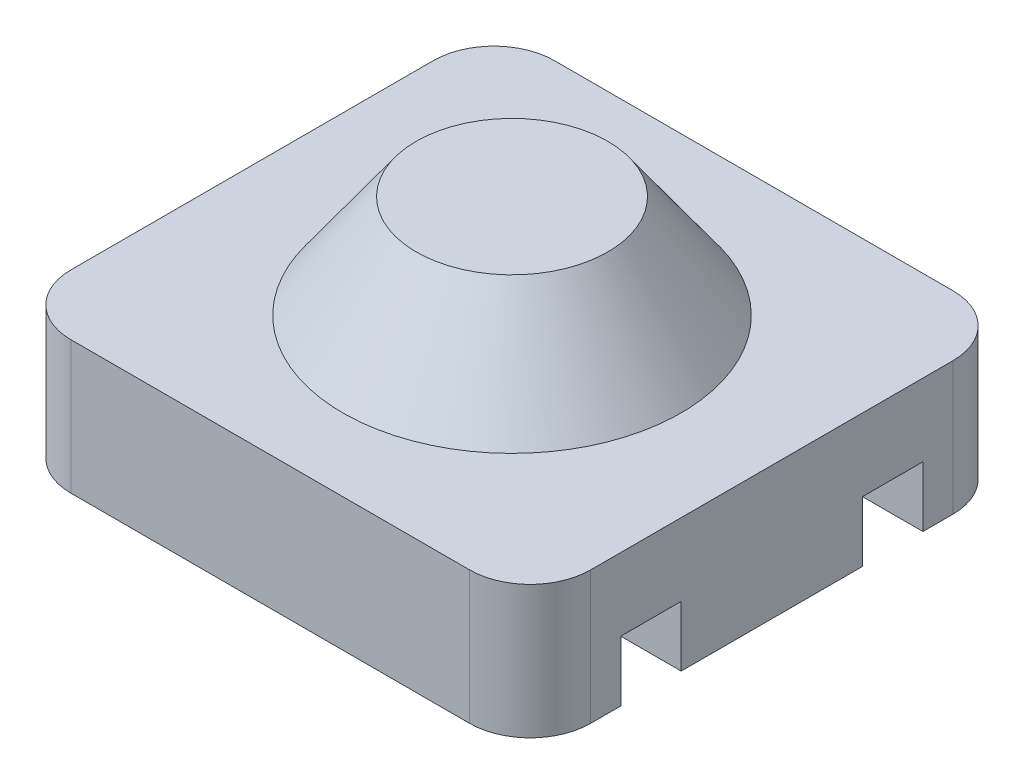
ISO-10303-21;
HEADER;
FILE_DESCRIPTION(('STEP AP214'),'2;1');
FILE_NAME('part.step','',(''),(''),'','','');
FILE_SCHEMA(('AUTOMOTIVE_DESIGN { 1 0 10303 214 1 1 1 1 }'));
ENDSEC;
DATA;
#1=APPLICATION_CONTEXT('core data for automotive mechanical design processes');
#2=APPLICATION_PROTOCOL_DEFINITION('international standard','automotive_design',2000,#1);
#3=PRODUCT_CONTEXT('',#1,'mechanical');
#4=PRODUCT('Part','Part','',(#3));
#5=PRODUCT_RELATED_PRODUCT_CATEGORY('part','',(#4));
#6=PRODUCT_DEFINITION_FORMATION('','',#4);
#7=PRODUCT_DEFINITION_CONTEXT('part definition',#1,'design');
#8=PRODUCT_DEFINITION('design','',#6,#7);
#9=PRODUCT_DEFINITION_SHAPE('','',#8);
#10=(LENGTH_UNIT() NAMED_UNIT(*) SI_UNIT(.MILLI.,.METRE.));
#11=(NAMED_UNIT(*) PLANE_ANGLE_UNIT() SI_UNIT($,.RADIAN.));
#12=(NAMED_UNIT(*) SI_UNIT($,.STERADIAN.) SOLID_ANGLE_UNIT());
#13=UNCERTAINTY_MEASURE_WITH_UNIT(LENGTH_MEASURE(1.E-05),#10,'distance_accuracy_value','');
#14=(GEOMETRIC_REPRESENTATION_CONTEXT(3) GLOBAL_UNCERTAINTY_ASSIGNED_CONTEXT((#13)) GLOBAL_UNIT_ASSIGNED_CONTEXT((#10,
#11,#12)) REPRESENTATION_CONTEXT('',''));
#15=CARTESIAN_POINT('',(0.,0.,0.));
#16=DIRECTION('',(0.,0.,1.));
#17=DIRECTION('',(1.,0.,0.));
#18=AXIS2_PLACEMENT_3D('',#15,#16,#17);
#19=CARTESIAN_POINT('',(0.,1.,-2.5));
#20=DIRECTION('',(0.,0.,-1.));
#21=DIRECTION('',(0.,-1.,0.));
#22=AXIS2_PLACEMENT_3D('',#19,#20,#21);
#23=PLANE('',#22);
#24=DIRECTION('',(1.,0.,0.));
#25=VECTOR('',#24,1.);
#26=CARTESIAN_POINT('',(0.,1.,-2.5));
#27=LINE('',#26,#25);
#28=CARTESIAN_POINT('',(0.,1.,-2.5));
#29=VERTEX_POINT('',#28);
#30=CARTESIAN_POINT('',(1.,1.,-2.5));
#31=VERTEX_POINT('',#30);
#32=EDGE_CURVE('E10',#29,#31,#27,.T.);
#33=ORIENTED_EDGE('',*,*,#32,.F.);
#34=DIRECTION('',(0.,-1.,0.));
#35=VECTOR('',#34,1.);
#36=CARTESIAN_POINT('',(0.,1.,-2.5));
#37=LINE('',#36,#35);
#38=CARTESIAN_POINT('',(0.,0.,-2.5));
#39=VERTEX_POINT('',#38);
#40=EDGE_CURVE('E402',#29,#39,#37,.T.);
#41=ORIENTED_EDGE('',*,*,#40,.T.);
#42=DIRECTION('',(1.,0.,0.));
#43=VECTOR('',#42,1.);
#44=CARTESIAN_POINT('',(0.,0.,-2.5));
#45=LINE('',#44,#43);
#46=CARTESIAN_POINT('',(1.,0.,-2.5));
#47=VERTEX_POINT('',#46);
#48=EDGE_CURVE('E321',#39,#47,#45,.T.);
#49=ORIENTED_EDGE('',*,*,#48,.T.);
#50=DIRECTION('',(0.,-1.,0.));
#51=VECTOR('',#50,1.);
#52=CARTESIAN_POINT('',(1.,-0.00100000000000013,-2.5));
#53=LINE('',#52,#51);
#54=EDGE_CURVE('E411',#31,#47,#53,.T.);
#55=ORIENTED_EDGE('',*,*,#54,.F.);
#56=EDGE_LOOP('',(#33,#41,#49,#55));
#57=FACE_BOUND('',#56,.T.);
#58=ADVANCED_FACE('F16',(#57),#23,.F.);
#59=CARTESIAN_POINT('',(0.,1.,-1.5));
#60=DIRECTION('',(0.,0.,1.));
#61=DIRECTION('',(1.,0.,0.));
#62=AXIS2_PLACEMENT_3D('',#59,#60,#61);
#63=PLANE('',#62);
#64=DIRECTION('',(-1.,0.,0.));
#65=VECTOR('',#64,1.);
#66=CARTESIAN_POINT('',(0.,0.,-1.5));
#67=LINE('',#66,#65);
#68=CARTESIAN_POINT('',(1.,0.,-1.5));
#69=VERTEX_POINT('',#68);
#70=CARTESIAN_POINT('',(0.,0.,-1.5));
#71=VERTEX_POINT('',#70);
#72=EDGE_CURVE('E406',#69,#71,#67,.T.);
#73=ORIENTED_EDGE('',*,*,#72,.T.);
#74=DIRECTION('',(0.,-1.,0.));
#75=VECTOR('',#74,1.);
#76=CARTESIAN_POINT('',(0.,1.,-1.5));
#77=LINE('',#76,#75);
#78=CARTESIAN_POINT('',(0.,1.,-1.5));
#79=VERTEX_POINT('',#78);
#80=EDGE_CURVE('E314',#79,#71,#77,.T.);
#81=ORIENTED_EDGE('',*,*,#80,.F.);
#82=DIRECTION('',(-1.,0.,0.));
#83=VECTOR('',#82,1.);
#84=CARTESIAN_POINT('',(0.,1.,-1.5));
#85=LINE('',#84,#83);
#86=CARTESIAN_POINT('',(1.,1.,-1.5));
#87=VERTEX_POINT('',#86);
#88=EDGE_CURVE('E27',#87,#79,#85,.T.);
#89=ORIENTED_EDGE('',*,*,#88,.F.);
#90=DIRECTION('',(0.,1.,0.));
#91=VECTOR('',#90,1.);
#92=CARTESIAN_POINT('',(1.,-0.00100000000000013,-1.5));
#93=LINE('',#92,#91);
#94=EDGE_CURVE('E412',#69,#87,#93,.T.);
#95=ORIENTED_EDGE('',*,*,#94,.F.);
#96=EDGE_LOOP('',(#73,#81,#89,#95));
#97=FACE_BOUND('',#96,.T.);
#98=ADVANCED_FACE('F1041',(#97),#63,.F.);
#99=CARTESIAN_POINT('',(0.,1.,0.));
#100=DIRECTION('',(0.,-1.,0.));
#101=DIRECTION('',(0.,0.,-1.));
#102=AXIS2_PLACEMENT_3D('',#99,#100,#101);
#103=PLANE('',#102);
#104=DIRECTION('',(0.,0.,1.));
#105=VECTOR('',#104,1.);
#106=CARTESIAN_POINT('',(1.,1.,-7.));
#107=LINE('',#106,#105);
#108=EDGE_CURVE('E407',#31,#87,#107,.T.);
#109=ORIENTED_EDGE('',*,*,#108,.T.);
#110=ORIENTED_EDGE('',*,*,#88,.T.);
#111=DIRECTION('',(0.,0.,-1.));
#112=VECTOR('',#111,1.);
#113=CARTESIAN_POINT('',(0.,1.,-1.5));
#114=LINE('',#113,#112);
#115=EDGE_CURVE('E310',#79,#29,#114,.T.);
#116=ORIENTED_EDGE('',*,*,#115,.T.);
#117=ORIENTED_EDGE('',*,*,#32,.T.);
#118=EDGE_LOOP('',(#109,#110,#116,#117));
#119=FACE_BOUND('',#118,.T.);
#120=ADVANCED_FACE('F986',(#119),#103,.T.);
#121=CARTESIAN_POINT('',(0.,1.,0.));
#122=DIRECTION('',(0.,-1.,0.));
#123=DIRECTION('',(0.,0.,-1.));
#124=AXIS2_PLACEMENT_3D('',#121,#122,#123);
#125=PLANE('',#124);
#126=DIRECTION('',(0.,0.,-1.));
#127=VECTOR('',#126,1.);
#128=CARTESIAN_POINT('',(7.6,1.,-7.));
#129=LINE('',#128,#127);
#130=CARTESIAN_POINT('',(7.6,1.,-1.5));
#131=VERTEX_POINT('',#130);
#132=CARTESIAN_POINT('',(7.6,1.,-2.5));
#133=VERTEX_POINT('',#132);
#134=EDGE_CURVE('E463',#131,#133,#129,.T.);
#135=ORIENTED_EDGE('',*,*,#134,.T.);
#136=DIRECTION('',(1.,0.,0.));
#137=VECTOR('',#136,1.);
#138=CARTESIAN_POINT('',(0.,1.,-2.5));
#139=LINE('',#138,#137);
#140=CARTESIAN_POINT('',(8.6,1.,-2.5));
#141=VERTEX_POINT('',#140);
#142=EDGE_CURVE('E280',#133,#141,#139,.T.);
#143=ORIENTED_EDGE('',*,*,#142,.T.);
#144=DIRECTION('',(0.,0.,1.));
#145=VECTOR('',#144,1.);
#146=CARTESIAN_POINT('',(8.6,1.,-1.5));
#147=LINE('',#146,#145);
#148=CARTESIAN_POINT('',(8.6,1.,-1.5));
#149=VERTEX_POINT('',#148);
#150=EDGE_CURVE('E342',#141,#149,#147,.T.);
#151=ORIENTED_EDGE('',*,*,#150,.T.);
#152=DIRECTION('',(-1.,0.,0.));
#153=VECTOR('',#152,1.);
#154=CARTESIAN_POINT('',(0.,1.,-1.5));
#155=LINE('',#154,#153);
#156=EDGE_CURVE('E490',#149,#131,#155,.T.);
#157=ORIENTED_EDGE('',*,*,#156,.T.);
#158=EDGE_LOOP('',(#135,#143,#151,#157));
#159=FACE_BOUND('',#158,.T.);
#160=ADVANCED_FACE('F689',(#159),#125,.T.);
#161=CARTESIAN_POINT('',(0.,1.,-1.5));
#162=DIRECTION('',(0.,0.,1.));
#163=DIRECTION('',(1.,0.,0.));
#164=AXIS2_PLACEMENT_3D('',#161,#162,#163);
#165=PLANE('',#164);
#166=ORIENTED_EDGE('',*,*,#156,.F.);
#167=DIRECTION('',(0.,-1.,0.));
#168=VECTOR('',#167,1.);
#169=CARTESIAN_POINT('',(8.6,1.,-1.5));
#170=LINE('',#169,#168);
#171=CARTESIAN_POINT('',(8.6,0.,-1.5));
#172=VERTEX_POINT('',#171);
#173=EDGE_CURVE('E346',#149,#172,#170,.T.);
#174=ORIENTED_EDGE('',*,*,#173,.T.);
#175=DIRECTION('',(-1.,0.,0.));
#176=VECTOR('',#175,1.);
#177=CARTESIAN_POINT('',(0.,0.,-1.5));
#178=LINE('',#177,#176);
#179=CARTESIAN_POINT('',(7.6,0.,-1.5));
#180=VERTEX_POINT('',#179);
#181=EDGE_CURVE('E413',#172,#180,#178,.T.);
#182=ORIENTED_EDGE('',*,*,#181,.T.);
#183=DIRECTION('',(0.,-1.,0.));
#184=VECTOR('',#183,1.);
#185=CARTESIAN_POINT('',(7.6,-0.00100000000000013,-1.5));
#186=LINE('',#185,#184);
#187=EDGE_CURVE('E308',#131,#180,#186,.T.);
#188=ORIENTED_EDGE('',*,*,#187,.F.);
#189=EDGE_LOOP('',(#166,#174,#182,#188));
#190=FACE_BOUND('',#189,.T.);
#191=ADVANCED_FACE('F692',(#190),#165,.F.);
#192=CARTESIAN_POINT('',(0.,1.,-2.5));
#193=DIRECTION('',(0.,0.,-1.));
#194=DIRECTION('',(0.,-1.,0.));
#195=AXIS2_PLACEMENT_3D('',#192,#193,#194);
#196=PLANE('',#195);
#197=DIRECTION('',(1.,0.,0.));
#198=VECTOR('',#197,1.);
#199=CARTESIAN_POINT('',(0.,0.,-2.5));
#200=LINE('',#199,#198);
#201=CARTESIAN_POINT('',(7.6,0.,-2.5));
#202=VERTEX_POINT('',#201);
#203=CARTESIAN_POINT('',(8.6,0.,-2.5));
#204=VERTEX_POINT('',#203);
#205=EDGE_CURVE('E428',#202,#204,#200,.T.);
#206=ORIENTED_EDGE('',*,*,#205,.T.);
#207=DIRECTION('',(0.,-1.,0.));
#208=VECTOR('',#207,1.);
#209=CARTESIAN_POINT('',(8.6,1.,-2.5));
#210=LINE('',#209,#208);
#211=EDGE_CURVE('E345',#141,#204,#210,.T.);
#212=ORIENTED_EDGE('',*,*,#211,.F.);
#213=ORIENTED_EDGE('',*,*,#142,.F.);
#214=DIRECTION('',(0.,1.,0.));
#215=VECTOR('',#214,1.);
#216=CARTESIAN_POINT('',(7.6,-0.00100000000000013,-2.5));
#217=LINE('',#216,#215);
#218=EDGE_CURVE('E500',#202,#133,#217,.T.);
#219=ORIENTED_EDGE('',*,*,#218,.F.);
#220=EDGE_LOOP('',(#206,#212,#213,#219));
#221=FACE_BOUND('',#220,.T.);
#222=ADVANCED_FACE('F686',(#221),#196,.F.);
#223=CARTESIAN_POINT('',(8.6,1.,-5.5));
#224=DIRECTION('',(0.,0.,1.));
#225=DIRECTION('',(1.,0.,0.));
#226=AXIS2_PLACEMENT_3D('',#223,#224,#225);
#227=PLANE('',#226);
#228=DIRECTION('',(-1.,0.,0.));
#229=VECTOR('',#228,1.);
#230=CARTESIAN_POINT('',(8.6,1.,-5.5));
#231=LINE('',#230,#229);
#232=CARTESIAN_POINT('',(8.6,1.,-5.5));
#233=VERTEX_POINT('',#232);
#234=CARTESIAN_POINT('',(7.6,1.,-5.5));
#235=VERTEX_POINT('',#234);
#236=EDGE_CURVE('E268',#233,#235,#231,.T.);
#237=ORIENTED_EDGE('',*,*,#236,.F.);
#238=DIRECTION('',(0.,-1.,0.));
#239=VECTOR('',#238,1.);
#240=CARTESIAN_POINT('',(8.6,1.,-5.5));
#241=LINE('',#240,#239);
#242=CARTESIAN_POINT('',(8.6,0.,-5.5));
#243=VERTEX_POINT('',#242);
#244=EDGE_CURVE('E453',#233,#243,#241,.T.);
#245=ORIENTED_EDGE('',*,*,#244,.T.);
#246=DIRECTION('',(-1.,0.,0.));
#247=VECTOR('',#246,1.);
#248=CARTESIAN_POINT('',(8.6,0.,-5.5));
#249=LINE('',#248,#247);
#250=CARTESIAN_POINT('',(7.6,0.,-5.5));
#251=VERTEX_POINT('',#250);
#252=EDGE_CURVE('E287',#243,#251,#249,.T.);
#253=ORIENTED_EDGE('',*,*,#252,.T.);
#254=DIRECTION('',(0.,-1.,0.));
#255=VECTOR('',#254,1.);
#256=CARTESIAN_POINT('',(7.6,-0.00100000000000013,-5.5));
#257=LINE('',#256,#255);
#258=EDGE_CURVE('E284',#235,#251,#257,.T.);
#259=ORIENTED_EDGE('',*,*,#258,.F.);
#260=EDGE_LOOP('',(#237,#245,#253,#259));
#261=FACE_BOUND('',#260,.T.);
#262=ADVANCED_FACE('F285',(#261),#227,.F.);
#263=CARTESIAN_POINT('',(8.6,1.,-6.5));
#264=DIRECTION('',(0.,0.,-1.));
#265=DIRECTION('',(0.,-1.,0.));
#266=AXIS2_PLACEMENT_3D('',#263,#264,#265);
#267=PLANE('',#266);
#268=DIRECTION('',(1.,0.,0.));
#269=VECTOR('',#268,1.);
#270=CARTESIAN_POINT('',(0.,0.,-6.5));
#271=LINE('',#270,#269);
#272=CARTESIAN_POINT('',(7.6,0.,-6.5));
#273=VERTEX_POINT('',#272);
#274=CARTESIAN_POINT('',(8.6,0.,-6.5));
#275=VERTEX_POINT('',#274);
#276=EDGE_CURVE('E380',#273,#275,#271,.T.);
#277=ORIENTED_EDGE('',*,*,#276,.T.);
#278=DIRECTION('',(0.,-1.,0.));
#279=VECTOR('',#278,1.);
#280=CARTESIAN_POINT('',(8.6,1.,-6.5));
#281=LINE('',#280,#279);
#282=CARTESIAN_POINT('',(8.6,1.,-6.5));
#283=VERTEX_POINT('',#282);
#284=EDGE_CURVE('E449',#283,#275,#281,.T.);
#285=ORIENTED_EDGE('',*,*,#284,.F.);
#286=DIRECTION('',(1.,0.,0.));
#287=VECTOR('',#286,1.);
#288=CARTESIAN_POINT('',(8.6,1.,-6.5));
#289=LINE('',#288,#287);
#290=CARTESIAN_POINT('',(7.6,1.,-6.5));
#291=VERTEX_POINT('',#290);
#292=EDGE_CURVE('E281',#291,#283,#289,.T.);
#293=ORIENTED_EDGE('',*,*,#292,.F.);
#294=DIRECTION('',(0.,1.,0.));
#295=VECTOR('',#294,1.);
#296=CARTESIAN_POINT('',(7.6,-0.00100000000000013,-6.5));
#297=LINE('',#296,#295);
#298=EDGE_CURVE('E297',#273,#291,#297,.T.);
#299=ORIENTED_EDGE('',*,*,#298,.F.);
#300=EDGE_LOOP('',(#277,#285,#293,#299));
#301=FACE_BOUND('',#300,.T.);
#302=ADVANCED_FACE('F660',(#301),#267,.F.);
#303=CARTESIAN_POINT('',(0.,1.,0.));
#304=DIRECTION('',(0.,1.,0.));
#305=DIRECTION('',(1.,0.,0.));
#306=AXIS2_PLACEMENT_3D('',#303,#304,#305);
#307=PLANE('',#306);
#308=ORIENTED_EDGE('',*,*,#292,.T.);
#309=DIRECTION('',(0.,0.,1.));
#310=VECTOR('',#309,1.);
#311=CARTESIAN_POINT('',(8.6,1.,-5.5));
#312=LINE('',#311,#310);
#313=EDGE_CURVE('E275',#283,#233,#312,.T.);
#314=ORIENTED_EDGE('',*,*,#313,.T.);
#315=ORIENTED_EDGE('',*,*,#236,.T.);
#316=DIRECTION('',(0.,0.,1.));
#317=VECTOR('',#316,1.);
#318=CARTESIAN_POINT('',(7.6,1.,-7.));
#319=LINE('',#318,#317);
#320=EDGE_CURVE('E272',#291,#235,#319,.T.);
#321=ORIENTED_EDGE('',*,*,#320,.F.);
#322=EDGE_LOOP('',(#308,#314,#315,#321));
#323=FACE_BOUND('',#322,.T.);
#324=ADVANCED_FACE('F270',(#323),#307,.F.);
#325=CARTESIAN_POINT('',(0.,1.,0.));
#326=DIRECTION('',(0.,1.,0.));
#327=DIRECTION('',(1.,0.,0.));
#328=AXIS2_PLACEMENT_3D('',#325,#326,#327);
#329=PLANE('',#328);
#330=DIRECTION('',(-1.,0.,0.));
#331=VECTOR('',#330,1.);
#332=CARTESIAN_POINT('',(8.6,1.,-5.5));
#333=LINE('',#332,#331);
#334=CARTESIAN_POINT('',(1.,1.,-5.5));
#335=VERTEX_POINT('',#334);
#336=CARTESIAN_POINT('',(0.,1.,-5.5));
#337=VERTEX_POINT('',#336);
#338=EDGE_CURVE('E383',#335,#337,#333,.T.);
#339=ORIENTED_EDGE('',*,*,#338,.T.);
#340=DIRECTION('',(0.,0.,-1.));
#341=VECTOR('',#340,1.);
#342=CARTESIAN_POINT('',(0.,1.,-5.5));
#343=LINE('',#342,#341);
#344=CARTESIAN_POINT('',(0.,1.,-6.5));
#345=VERTEX_POINT('',#344);
#346=EDGE_CURVE('E559',#337,#345,#343,.T.);
#347=ORIENTED_EDGE('',*,*,#346,.T.);
#348=DIRECTION('',(1.,0.,0.));
#349=VECTOR('',#348,1.);
#350=CARTESIAN_POINT('',(8.6,1.,-6.5));
#351=LINE('',#350,#349);
#352=CARTESIAN_POINT('',(1.,1.,-6.5));
#353=VERTEX_POINT('',#352);
#354=EDGE_CURVE('E470',#345,#353,#351,.T.);
#355=ORIENTED_EDGE('',*,*,#354,.T.);
#356=DIRECTION('',(0.,0.,-1.));
#357=VECTOR('',#356,1.);
#358=CARTESIAN_POINT('',(1.,1.,-7.));
#359=LINE('',#358,#357);
#360=EDGE_CURVE('E525',#335,#353,#359,.T.);
#361=ORIENTED_EDGE('',*,*,#360,.F.);
#362=EDGE_LOOP('',(#339,#347,#355,#361));
#363=FACE_BOUND('',#362,.T.);
#364=ADVANCED_FACE('F969',(#363),#329,.F.);
#365=CARTESIAN_POINT('',(8.6,1.,-5.5));
#366=DIRECTION('',(0.,0.,1.));
#367=DIRECTION('',(1.,0.,0.));
#368=AXIS2_PLACEMENT_3D('',#365,#366,#367);
#369=PLANE('',#368);
#370=DIRECTION('',(-1.,0.,0.));
#371=VECTOR('',#370,1.);
#372=CARTESIAN_POINT('',(0.,0.,-5.5));
#373=LINE('',#372,#371);
#374=CARTESIAN_POINT('',(1.,0.,-5.5));
#375=VERTEX_POINT('',#374);
#376=CARTESIAN_POINT('',(0.,0.,-5.5));
#377=VERTEX_POINT('',#376);
#378=EDGE_CURVE('E320',#375,#377,#373,.T.);
#379=ORIENTED_EDGE('',*,*,#378,.T.);
#380=DIRECTION('',(0.,-1.,0.));
#381=VECTOR('',#380,1.);
#382=CARTESIAN_POINT('',(0.,1.,-5.5));
#383=LINE('',#382,#381);
#384=EDGE_CURVE('E469',#337,#377,#383,.T.);
#385=ORIENTED_EDGE('',*,*,#384,.F.);
#386=ORIENTED_EDGE('',*,*,#338,.F.);
#387=DIRECTION('',(0.,1.,0.));
#388=VECTOR('',#387,1.);
#389=CARTESIAN_POINT('',(1.,-0.00100000000000013,-5.5));
#390=LINE('',#389,#388);
#391=EDGE_CURVE('E521',#375,#335,#390,.T.);
#392=ORIENTED_EDGE('',*,*,#391,.F.);
#393=EDGE_LOOP('',(#379,#385,#386,#392));
#394=FACE_BOUND('',#393,.T.);
#395=ADVANCED_FACE('F975',(#394),#369,.F.);
#396=CARTESIAN_POINT('',(8.6,1.,-6.5));
#397=DIRECTION('',(0.,0.,-1.));
#398=DIRECTION('',(0.,-1.,0.));
#399=AXIS2_PLACEMENT_3D('',#396,#397,#398);
#400=PLANE('',#399);
#401=ORIENTED_EDGE('',*,*,#354,.F.);
#402=DIRECTION('',(0.,-1.,0.));
#403=VECTOR('',#402,1.);
#404=CARTESIAN_POINT('',(0.,1.,-6.5));
#405=LINE('',#404,#403);
#406=CARTESIAN_POINT('',(0.,0.,-6.5));
#407=VERTEX_POINT('',#406);
#408=EDGE_CURVE('E556',#345,#407,#405,.T.);
#409=ORIENTED_EDGE('',*,*,#408,.T.);
#410=DIRECTION('',(1.,0.,0.));
#411=VECTOR('',#410,1.);
#412=CARTESIAN_POINT('',(8.6,0.,-6.5));
#413=LINE('',#412,#411);
#414=CARTESIAN_POINT('',(1.,0.,-6.5));
#415=VERTEX_POINT('',#414);
#416=EDGE_CURVE('E370',#407,#415,#413,.T.);
#417=ORIENTED_EDGE('',*,*,#416,.T.);
#418=DIRECTION('',(0.,-1.,0.));
#419=VECTOR('',#418,1.);
#420=CARTESIAN_POINT('',(1.,-0.00100000000000013,-6.5));
#421=LINE('',#420,#419);
#422=EDGE_CURVE('E332',#353,#415,#421,.T.);
#423=ORIENTED_EDGE('',*,*,#422,.F.);
#424=EDGE_LOOP('',(#401,#409,#417,#423));
#425=FACE_BOUND('',#424,.T.);
#426=ADVANCED_FACE('F635',(#425),#400,.F.);
#427=CARTESIAN_POINT('',(4.3,3.9,-4.));
#428=DIRECTION('',(0.,1.,0.));
#429=DIRECTION('',(1.,0.,0.));
#430=AXIS2_PLACEMENT_3D('',#427,#428,#429);
#431=PLANE('',#430);
#432=CARTESIAN_POINT('',(4.3,3.9,-4.));
#433=DIRECTION('',(0.,-1.,0.));
#434=DIRECTION('',(1.,0.,0.));
#435=AXIS2_PLACEMENT_3D('',#432,#433,#434);
#436=CIRCLE('',#435,1.58571428571429);
#437=CARTESIAN_POINT('',(2.71428571428571,3.9,-4.));
#438=VERTEX_POINT('',#437);
#439=EDGE_CURVE('E461',#438,#438,#436,.T.);
#440=ORIENTED_EDGE('',*,*,#439,.F.);
#441=EDGE_LOOP('',(#440));
#442=FACE_BOUND('',#441,.T.);
#443=ADVANCED_FACE('F1059',(#442),#431,.T.);
#444=CARTESIAN_POINT('',(5.8,3.6,-4.));
#445=DIRECTION('',(0.,-1.,0.));
#446=DIRECTION('',(0.,0.,-1.));
#447=AXIS2_PLACEMENT_3D('',#444,#445,#446);
#448=PLANE('',#447);
#449=CARTESIAN_POINT('',(4.3,3.6,-4.));
#450=DIRECTION('',(0.,-1.,0.));
#451=DIRECTION('',(1.,0.,0.));
#452=AXIS2_PLACEMENT_3D('',#449,#450,#451);
#453=CIRCLE('',#452,1.5);
#454=CARTESIAN_POINT('',(2.8,3.6,-4.));
#455=VERTEX_POINT('',#454);
#456=EDGE_CURVE('E526',#455,#455,#453,.T.);
#457=ORIENTED_EDGE('',*,*,#456,.T.);
#458=EDGE_LOOP('',(#457));
#459=FACE_BOUND('',#458,.T.);
#460=ADVANCED_FACE('F1031',(#459),#448,.T.);
#461=CARTESIAN_POINT('',(0.,2.,0.));
#462=DIRECTION('',(0.,1.,0.));
#463=DIRECTION('',(1.,0.,0.));
#464=AXIS2_PLACEMENT_3D('',#461,#462,#463);
#465=PLANE('',#464);
#466=CARTESIAN_POINT('',(4.3,2.,-4.));
#467=DIRECTION('',(0.,1.,0.));
#468=DIRECTION('',(0.,0.,1.));
#469=AXIS2_PLACEMENT_3D('',#466,#467,#468);
#470=CIRCLE('',#469,2.5);
#471=CARTESIAN_POINT('',(4.3,2.,-6.5));
#472=VERTEX_POINT('',#471);
#473=EDGE_CURVE('E452',#472,#472,#470,.T.);
#474=ORIENTED_EDGE('',*,*,#473,.T.);
#475=EDGE_LOOP('',(#474));
#476=FACE_BOUND('',#475,.T.);
#477=DIRECTION('',(0.,0.,1.));
#478=VECTOR('',#477,1.);
#479=CARTESIAN_POINT('',(1.,2.,-7.));
#480=LINE('',#479,#478);
#481=CARTESIAN_POINT('',(1.,2.,-7.));
#482=VERTEX_POINT('',#481);
#483=CARTESIAN_POINT('',(1.,2.,-1.));
#484=VERTEX_POINT('',#483);
#485=EDGE_CURVE('E331',#482,#484,#480,.T.);
#486=ORIENTED_EDGE('',*,*,#485,.F.);
#487=DIRECTION('',(-1.,0.,0.));
#488=VECTOR('',#487,1.);
#489=CARTESIAN_POINT('',(1.,2.,-7.));
#490=LINE('',#489,#488);
#491=CARTESIAN_POINT('',(7.6,2.,-7.));
#492=VERTEX_POINT('',#491);
#493=EDGE_CURVE('E336',#492,#482,#490,.T.);
#494=ORIENTED_EDGE('',*,*,#493,.F.);
#495=DIRECTION('',(0.,0.,-1.));
#496=VECTOR('',#495,1.);
#497=CARTESIAN_POINT('',(7.6,2.,-7.));
#498=LINE('',#497,#496);
#499=CARTESIAN_POINT('',(7.6,2.,-1.));
#500=VERTEX_POINT('',#499);
#501=EDGE_CURVE('E304',#500,#492,#498,.T.);
#502=ORIENTED_EDGE('',*,*,#501,.F.);
#503=DIRECTION('',(1.,0.,0.));
#504=VECTOR('',#503,1.);
#505=CARTESIAN_POINT('',(1.,2.,-1.));
#506=LINE('',#505,#504);
#507=EDGE_CURVE('E315',#484,#500,#506,.T.);
#508=ORIENTED_EDGE('',*,*,#507,.F.);
#509=EDGE_LOOP('',(#486,#494,#502,#508));
#510=FACE_BOUND('',#509,.T.);
#511=ADVANCED_FACE('F1027',(#476,#510),#465,.F.);
#512=CARTESIAN_POINT('',(7.6,2.2,-7.));
#513=DIRECTION('',(0.,-1.,0.));
#514=DIRECTION('',(0.,0.,-1.));
#515=AXIS2_PLACEMENT_3D('',#512,#513,#514);
#516=CYLINDRICAL_SURFACE('',#515,1.);
#517=CARTESIAN_POINT('',(7.6,2.2,-7.));
#518=DIRECTION('',(0.,1.,0.));
#519=DIRECTION('',(0.,0.,-1.));
#520=AXIS2_PLACEMENT_3D('',#517,#518,#519);
#521=CIRCLE('',#520,1.);
#522=CARTESIAN_POINT('',(8.6,2.2,-7.));
#523=VERTEX_POINT('',#522);
#524=CARTESIAN_POINT('',(7.6,2.2,-8.));
#525=VERTEX_POINT('',#524);
#526=EDGE_CURVE('E41',#523,#525,#521,.T.);
#527=ORIENTED_EDGE('',*,*,#526,.F.);
#528=DIRECTION('',(0.,1.,0.));
#529=VECTOR('',#528,1.);
#530=CARTESIAN_POINT('',(8.6,2.2,-7.));
#531=LINE('',#530,#529);
#532=CARTESIAN_POINT('',(8.6,0.,-7.));
#533=VERTEX_POINT('',#532);
#534=EDGE_CURVE('E444',#533,#523,#531,.T.);
#535=ORIENTED_EDGE('',*,*,#534,.F.);
#536=CARTESIAN_POINT('',(7.6,0.,-7.));
#537=DIRECTION('',(0.,-1.,0.));
#538=DIRECTION('',(0.,0.,-1.));
#539=AXIS2_PLACEMENT_3D('',#536,#537,#538);
#540=CIRCLE('',#539,1.);
#541=CARTESIAN_POINT('',(7.6,0.,-8.));
#542=VERTEX_POINT('',#541);
#543=EDGE_CURVE('E348',#542,#533,#540,.T.);
#544=ORIENTED_EDGE('',*,*,#543,.F.);
#545=DIRECTION('',(0.,-1.,0.));
#546=VECTOR('',#545,1.);
#547=CARTESIAN_POINT('',(7.6,2.2,-8.));
#548=LINE('',#547,#546);
#549=EDGE_CURVE('E322',#525,#542,#548,.T.);
#550=ORIENTED_EDGE('',*,*,#549,.F.);
#551=EDGE_LOOP('',(#527,#535,#544,#550));
#552=FACE_BOUND('',#551,.T.);
#553=ADVANCED_FACE('F652',(#552),#516,.T.);
#554=CARTESIAN_POINT('',(7.6,2.2,-1.));
#555=DIRECTION('',(0.,-1.,0.));
#556=DIRECTION('',(0.,0.,-1.));
#557=AXIS2_PLACEMENT_3D('',#554,#555,#556);
#558=CYLINDRICAL_SURFACE('',#557,1.);
#559=CARTESIAN_POINT('',(7.6,2.2,-1.));
#560=DIRECTION('',(0.,1.,0.));
#561=DIRECTION('',(0.,0.,-1.));
#562=AXIS2_PLACEMENT_3D('',#559,#560,#561);
#563=CIRCLE('',#562,1.);
#564=CARTESIAN_POINT('',(7.6,2.2,0.));
#565=VERTEX_POINT('',#564);
#566=CARTESIAN_POINT('',(8.6,2.2,-1.));
#567=VERTEX_POINT('',#566);
#568=EDGE_CURVE('E387',#565,#567,#563,.T.);
#569=ORIENTED_EDGE('',*,*,#568,.F.);
#570=DIRECTION('',(0.,1.,0.));
#571=VECTOR('',#570,1.);
#572=CARTESIAN_POINT('',(7.6,2.2,0.));
#573=LINE('',#572,#571);
#574=CARTESIAN_POINT('',(7.6,0.,0.));
#575=VERTEX_POINT('',#574);
#576=EDGE_CURVE('E434',#575,#565,#573,.T.);
#577=ORIENTED_EDGE('',*,*,#576,.F.);
#578=CARTESIAN_POINT('',(7.6,0.,-1.));
#579=DIRECTION('',(0.,-1.,0.));
#580=DIRECTION('',(0.,0.,-1.));
#581=AXIS2_PLACEMENT_3D('',#578,#579,#580);
#582=CIRCLE('',#581,1.);
#583=CARTESIAN_POINT('',(8.6,0.,-1.));
#584=VERTEX_POINT('',#583);
#585=EDGE_CURVE('E421',#584,#575,#582,.T.);
#586=ORIENTED_EDGE('',*,*,#585,.F.);
#587=DIRECTION('',(0.,-1.,0.));
#588=VECTOR('',#587,1.);
#589=CARTESIAN_POINT('',(8.6,2.2,-1.));
#590=LINE('',#589,#588);
#591=EDGE_CURVE('E493',#567,#584,#590,.T.);
#592=ORIENTED_EDGE('',*,*,#591,.F.);
#593=EDGE_LOOP('',(#569,#577,#586,#592));
#594=FACE_BOUND('',#593,.T.);
#595=ADVANCED_FACE('F956',(#594),#558,.T.);
#596=CARTESIAN_POINT('',(1.,2.2,-1.));
#597=DIRECTION('',(0.,-1.,0.));
#598=DIRECTION('',(0.,0.,-1.));
#599=AXIS2_PLACEMENT_3D('',#596,#597,#598);
#600=CYLINDRICAL_SURFACE('',#599,1.);
#601=CARTESIAN_POINT('',(1.,2.2,-1.));
#602=DIRECTION('',(0.,1.,0.));
#603=DIRECTION('',(0.,0.,-1.));
#604=AXIS2_PLACEMENT_3D('',#601,#602,#603);
#605=CIRCLE('',#604,1.);
#606=CARTESIAN_POINT('',(0.,2.2,-1.));
#607=VERTEX_POINT('',#606);
#608=CARTESIAN_POINT('',(1.,2.2,0.));
#609=VERTEX_POINT('',#608);
#610=EDGE_CURVE('E390',#607,#609,#605,.T.);
#611=ORIENTED_EDGE('',*,*,#610,.F.);
#612=DIRECTION('',(0.,1.,0.));
#613=VECTOR('',#612,1.);
#614=CARTESIAN_POINT('',(0.,2.2,-1.));
#615=LINE('',#614,#613);
#616=CARTESIAN_POINT('',(0.,0.,-1.));
#617=VERTEX_POINT('',#616);
#618=EDGE_CURVE('E335',#617,#607,#615,.T.);
#619=ORIENTED_EDGE('',*,*,#618,.F.);
#620=CARTESIAN_POINT('',(1.,0.,-1.));
#621=DIRECTION('',(0.,-1.,0.));
#622=DIRECTION('',(0.,0.,-1.));
#623=AXIS2_PLACEMENT_3D('',#620,#621,#622);
#624=CIRCLE('',#623,1.);
#625=CARTESIAN_POINT('',(1.,0.,0.));
#626=VERTEX_POINT('',#625);
#627=EDGE_CURVE('E510',#626,#617,#624,.T.);
#628=ORIENTED_EDGE('',*,*,#627,.F.);
#629=DIRECTION('',(0.,-1.,0.));
#630=VECTOR('',#629,1.);
#631=CARTESIAN_POINT('',(1.,2.2,0.));
#632=LINE('',#631,#630);
#633=EDGE_CURVE('E401',#609,#626,#632,.T.);
#634=ORIENTED_EDGE('',*,*,#633,.F.);
#635=EDGE_LOOP('',(#611,#619,#628,#634));
#636=FACE_BOUND('',#635,.T.);
#637=ADVANCED_FACE('F959',(#636),#600,.T.);
#638=CARTESIAN_POINT('',(1.,2.2,-7.));
#639=DIRECTION('',(0.,-1.,0.));
#640=DIRECTION('',(0.,0.,-1.));
#641=AXIS2_PLACEMENT_3D('',#638,#639,#640);
#642=CYLINDRICAL_SURFACE('',#641,1.);
#643=CARTESIAN_POINT('',(1.,2.2,-7.));
#644=DIRECTION('',(0.,1.,0.));
#645=DIRECTION('',(0.,0.,-1.));
#646=AXIS2_PLACEMENT_3D('',#643,#644,#645);
#647=CIRCLE('',#646,1.);
#648=CARTESIAN_POINT('',(1.,2.2,-8.));
#649=VERTEX_POINT('',#648);
#650=CARTESIAN_POINT('',(0.,2.2,-7.));
#651=VERTEX_POINT('',#650);
#652=EDGE_CURVE('E325',#649,#651,#647,.T.);
#653=ORIENTED_EDGE('',*,*,#652,.F.);
#654=DIRECTION('',(0.,1.,0.));
#655=VECTOR('',#654,1.);
#656=CARTESIAN_POINT('',(1.,2.2,-8.));
#657=LINE('',#656,#655);
#658=CARTESIAN_POINT('',(1.,0.,-8.));
#659=VERTEX_POINT('',#658);
#660=EDGE_CURVE('E506',#659,#649,#657,.T.);
#661=ORIENTED_EDGE('',*,*,#660,.F.);
#662=CARTESIAN_POINT('',(1.,0.,-7.));
#663=DIRECTION('',(0.,-1.,0.));
#664=DIRECTION('',(0.,0.,-1.));
#665=AXIS2_PLACEMENT_3D('',#662,#663,#664);
#666=CIRCLE('',#665,1.);
#667=CARTESIAN_POINT('',(0.,0.,-7.));
#668=VERTEX_POINT('',#667);
#669=EDGE_CURVE('E369',#668,#659,#666,.T.);
#670=ORIENTED_EDGE('',*,*,#669,.F.);
#671=DIRECTION('',(0.,-1.,0.));
#672=VECTOR('',#671,1.);
#673=CARTESIAN_POINT('',(0.,2.2,-7.));
#674=LINE('',#673,#672);
#675=EDGE_CURVE('E358',#651,#668,#674,.T.);
#676=ORIENTED_EDGE('',*,*,#675,.F.);
#677=EDGE_LOOP('',(#653,#661,#670,#676));
#678=FACE_BOUND('',#677,.T.);
#679=ADVANCED_FACE('F646',(#678),#642,.T.);
#680=CARTESIAN_POINT('',(0.,0.,0.));
#681=DIRECTION('',(0.,-1.,0.));
#682=DIRECTION('',(0.,0.,-1.));
#683=AXIS2_PLACEMENT_3D('',#680,#681,#682);
#684=PLANE('',#683);
#685=ORIENTED_EDGE('',*,*,#205,.F.);
#686=DIRECTION('',(0.,0.,-1.));
#687=VECTOR('',#686,1.);
#688=CARTESIAN_POINT('',(7.6,0.,-7.));
#689=LINE('',#688,#687);
#690=EDGE_CURVE('E292',#202,#251,#689,.T.);
#691=ORIENTED_EDGE('',*,*,#690,.T.);
#692=ORIENTED_EDGE('',*,*,#252,.F.);
#693=DIRECTION('',(0.,0.,-1.));
#694=VECTOR('',#693,1.);
#695=CARTESIAN_POINT('',(8.6,0.,0.));
#696=LINE('',#695,#694);
#697=EDGE_CURVE('E455',#204,#243,#696,.T.);
#698=ORIENTED_EDGE('',*,*,#697,.F.);
#699=EDGE_LOOP('',(#685,#691,#692,#698));
#700=FACE_BOUND('',#699,.T.);
#701=ADVANCED_FACE('F681',(#700),#684,.T.);
#702=CARTESIAN_POINT('',(0.,2.2,0.));
#703=DIRECTION('',(0.,-1.,0.));
#704=DIRECTION('',(0.,0.,-1.));
#705=AXIS2_PLACEMENT_3D('',#702,#703,#704);
#706=PLANE('',#705);
#707=CARTESIAN_POINT('',(4.3,2.2,-4.));
#708=DIRECTION('',(0.,-1.,0.));
#709=DIRECTION('',(1.,0.,0.));
#710=AXIS2_PLACEMENT_3D('',#707,#708,#709);
#711=CIRCLE('',#710,2.8);
#712=CARTESIAN_POINT('',(1.5,2.2,-4.));
#713=VERTEX_POINT('',#712);
#714=EDGE_CURVE('E462',#713,#713,#711,.T.);
#715=ORIENTED_EDGE('',*,*,#714,.T.);
#716=EDGE_LOOP('',(#715));
#717=FACE_BOUND('',#716,.T.);
#718=DIRECTION('',(-1.,0.,0.));
#719=VECTOR('',#718,1.);
#720=CARTESIAN_POINT('',(0.,2.2,-8.));
#721=LINE('',#720,#719);
#722=EDGE_CURVE('E326',#525,#649,#721,.T.);
#723=ORIENTED_EDGE('',*,*,#722,.T.);
#724=ORIENTED_EDGE('',*,*,#652,.T.);
#725=DIRECTION('',(0.,0.,1.));
#726=VECTOR('',#725,1.);
#727=CARTESIAN_POINT('',(0.,2.2,0.));
#728=LINE('',#727,#726);
#729=EDGE_CURVE('E354',#651,#607,#728,.T.);
#730=ORIENTED_EDGE('',*,*,#729,.T.);
#731=ORIENTED_EDGE('',*,*,#610,.T.);
#732=DIRECTION('',(1.,0.,0.));
#733=VECTOR('',#732,1.);
#734=CARTESIAN_POINT('',(0.,2.2,0.));
#735=LINE('',#734,#733);
#736=EDGE_CURVE('E397',#609,#565,#735,.T.);
#737=ORIENTED_EDGE('',*,*,#736,.T.);
#738=ORIENTED_EDGE('',*,*,#568,.T.);
#739=DIRECTION('',(0.,0.,-1.));
#740=VECTOR('',#739,1.);
#741=CARTESIAN_POINT('',(8.6,2.2,0.));
#742=LINE('',#741,#740);
#743=EDGE_CURVE('E448',#567,#523,#742,.T.);
#744=ORIENTED_EDGE('',*,*,#743,.T.);
#745=ORIENTED_EDGE('',*,*,#526,.T.);
#746=EDGE_LOOP('',(#723,#724,#730,#731,#737,#738,#744,#745));
#747=FACE_BOUND('',#746,.T.);
#748=ADVANCED_FACE('F957',(#717,#747),#706,.F.);
#749=CARTESIAN_POINT('',(0.,2.2,-8.));
#750=DIRECTION('',(0.,0.,1.));
#751=DIRECTION('',(1.,0.,0.));
#752=AXIS2_PLACEMENT_3D('',#749,#750,#751);
#753=PLANE('',#752);
#754=DIRECTION('',(-1.,0.,0.));
#755=VECTOR('',#754,1.);
#756=CARTESIAN_POINT('',(0.,0.,-8.));
#757=LINE('',#756,#755);
#758=EDGE_CURVE('E353',#542,#659,#757,.T.);
#759=ORIENTED_EDGE('',*,*,#758,.T.);
#760=ORIENTED_EDGE('',*,*,#660,.T.);
#761=ORIENTED_EDGE('',*,*,#722,.F.);
#762=ORIENTED_EDGE('',*,*,#549,.T.);
#763=EDGE_LOOP('',(#759,#760,#761,#762));
#764=FACE_BOUND('',#763,.T.);
#765=ADVANCED_FACE('F649',(#764),#753,.F.);
#766=CARTESIAN_POINT('',(8.6,2.2,0.));
#767=DIRECTION('',(-1.,0.,0.));
#768=DIRECTION('',(0.,0.,1.));
#769=AXIS2_PLACEMENT_3D('',#766,#767,#768);
#770=PLANE('',#769);
#771=DIRECTION('',(0.,0.,-1.));
#772=VECTOR('',#771,1.);
#773=CARTESIAN_POINT('',(8.6,0.,0.));
#774=LINE('',#773,#772);
#775=EDGE_CURVE('E417',#584,#172,#774,.T.);
#776=ORIENTED_EDGE('',*,*,#775,.T.);
#777=ORIENTED_EDGE('',*,*,#173,.F.);
#778=ORIENTED_EDGE('',*,*,#150,.F.);
#779=ORIENTED_EDGE('',*,*,#211,.T.);
#780=ORIENTED_EDGE('',*,*,#697,.T.);
#781=ORIENTED_EDGE('',*,*,#244,.F.);
#782=ORIENTED_EDGE('',*,*,#313,.F.);
#783=ORIENTED_EDGE('',*,*,#284,.T.);
#784=DIRECTION('',(0.,0.,-1.));
#785=VECTOR('',#784,1.);
#786=CARTESIAN_POINT('',(8.6,0.,0.));
#787=LINE('',#786,#785);
#788=EDGE_CURVE('E352',#275,#533,#787,.T.);
#789=ORIENTED_EDGE('',*,*,#788,.T.);
#790=ORIENTED_EDGE('',*,*,#534,.T.);
#791=ORIENTED_EDGE('',*,*,#743,.F.);
#792=ORIENTED_EDGE('',*,*,#591,.T.);
#793=EDGE_LOOP('',(#776,#777,#778,#779,#780,#781,#782,#783,#789,#790,#791,#792));
#794=FACE_BOUND('',#793,.T.);
#795=ADVANCED_FACE('F656',(#794),#770,.F.);
#796=CARTESIAN_POINT('',(0.,2.2,0.));
#797=DIRECTION('',(0.,0.,-1.));
#798=DIRECTION('',(0.,-1.,0.));
#799=AXIS2_PLACEMENT_3D('',#796,#797,#798);
#800=PLANE('',#799);
#801=ORIENTED_EDGE('',*,*,#736,.F.);
#802=ORIENTED_EDGE('',*,*,#633,.T.);
#803=DIRECTION('',(1.,0.,0.));
#804=VECTOR('',#803,1.);
#805=CARTESIAN_POINT('',(0.,0.,0.));
#806=LINE('',#805,#804);
#807=EDGE_CURVE('E514',#626,#575,#806,.T.);
#808=ORIENTED_EDGE('',*,*,#807,.T.);
#809=ORIENTED_EDGE('',*,*,#576,.T.);
#810=EDGE_LOOP('',(#801,#802,#808,#809));
#811=FACE_BOUND('',#810,.T.);
#812=ADVANCED_FACE('F947',(#811),#800,.F.);
#813=CARTESIAN_POINT('',(0.,2.2,0.));
#814=DIRECTION('',(1.,0.,0.));
#815=DIRECTION('',(0.,1.,0.));
#816=AXIS2_PLACEMENT_3D('',#813,#814,#815);
#817=PLANE('',#816);
#818=ORIENTED_EDGE('',*,*,#115,.F.);
#819=ORIENTED_EDGE('',*,*,#80,.T.);
#820=DIRECTION('',(0.,0.,1.));
#821=VECTOR('',#820,1.);
#822=CARTESIAN_POINT('',(0.,0.,0.));
#823=LINE('',#822,#821);
#824=EDGE_CURVE('E20',#71,#617,#823,.T.);
#825=ORIENTED_EDGE('',*,*,#824,.T.);
#826=ORIENTED_EDGE('',*,*,#618,.T.);
#827=ORIENTED_EDGE('',*,*,#729,.F.);
#828=ORIENTED_EDGE('',*,*,#675,.T.);
#829=DIRECTION('',(0.,0.,1.));
#830=VECTOR('',#829,1.);
#831=CARTESIAN_POINT('',(0.,0.,0.));
#832=LINE('',#831,#830);
#833=EDGE_CURVE('E365',#668,#407,#832,.T.);
#834=ORIENTED_EDGE('',*,*,#833,.T.);
#835=ORIENTED_EDGE('',*,*,#408,.F.);
#836=ORIENTED_EDGE('',*,*,#346,.F.);
#837=ORIENTED_EDGE('',*,*,#384,.T.);
#838=DIRECTION('',(0.,0.,1.));
#839=VECTOR('',#838,1.);
#840=CARTESIAN_POINT('',(0.,0.,0.));
#841=LINE('',#840,#839);
#842=EDGE_CURVE('E316',#377,#39,#841,.T.);
#843=ORIENTED_EDGE('',*,*,#842,.T.);
#844=ORIENTED_EDGE('',*,*,#40,.F.);
#845=EDGE_LOOP('',(#818,#819,#825,#826,#827,#828,#834,#835,#836,#837,#843,#844));
#846=FACE_BOUND('',#845,.T.);
#847=ADVANCED_FACE('F640',(#846),#817,.F.);
#848=CARTESIAN_POINT('',(1.,-0.00100000000000013,-1.));
#849=DIRECTION('',(0.,0.,1.));
#850=DIRECTION('',(1.,0.,0.));
#851=AXIS2_PLACEMENT_3D('',#848,#849,#850);
#852=PLANE('',#851);
#853=ORIENTED_EDGE('',*,*,#507,.T.);
#854=DIRECTION('',(0.,1.,0.));
#855=VECTOR('',#854,1.);
#856=CARTESIAN_POINT('',(7.6,-0.00100000000000013,-1.));
#857=LINE('',#856,#855);
#858=CARTESIAN_POINT('',(7.6,0.,-1.));
#859=VERTEX_POINT('',#858);
#860=EDGE_CURVE('E437',#859,#500,#857,.T.);
#861=ORIENTED_EDGE('',*,*,#860,.F.);
#862=DIRECTION('',(1.,0.,0.));
#863=VECTOR('',#862,1.);
#864=CARTESIAN_POINT('',(1.,0.,-1.));
#865=LINE('',#864,#863);
#866=CARTESIAN_POINT('',(1.,0.,-1.));
#867=VERTEX_POINT('',#866);
#868=EDGE_CURVE('E359',#867,#859,#865,.T.);
#869=ORIENTED_EDGE('',*,*,#868,.F.);
#870=DIRECTION('',(0.,1.,0.));
#871=VECTOR('',#870,1.);
#872=CARTESIAN_POINT('',(1.,-0.00100000000000013,-1.));
#873=LINE('',#872,#871);
#874=EDGE_CURVE('E341',#867,#484,#873,.T.);
#875=ORIENTED_EDGE('',*,*,#874,.T.);
#876=EDGE_LOOP('',(#853,#861,#869,#875));
#877=FACE_BOUND('',#876,.T.);
#878=ADVANCED_FACE('F1074',(#877),#852,.F.);
#879=CARTESIAN_POINT('',(7.6,-0.00100000000000013,-7.));
#880=DIRECTION('',(1.,0.,0.));
#881=DIRECTION('',(0.,1.,0.));
#882=AXIS2_PLACEMENT_3D('',#879,#880,#881);
#883=PLANE('',#882);
#884=ORIENTED_EDGE('',*,*,#134,.F.);
#885=ORIENTED_EDGE('',*,*,#187,.T.);
#886=DIRECTION('',(0.,0.,-1.));
#887=VECTOR('',#886,1.);
#888=CARTESIAN_POINT('',(7.6,0.,-7.));
#889=LINE('',#888,#887);
#890=EDGE_CURVE('E363',#859,#180,#889,.T.);
#891=ORIENTED_EDGE('',*,*,#890,.F.);
#892=ORIENTED_EDGE('',*,*,#860,.T.);
#893=ORIENTED_EDGE('',*,*,#501,.T.);
#894=DIRECTION('',(0.,1.,0.));
#895=VECTOR('',#894,1.);
#896=CARTESIAN_POINT('',(7.6,-0.00100000000000013,-7.));
#897=LINE('',#896,#895);
#898=CARTESIAN_POINT('',(7.6,0.,-7.));
#899=VERTEX_POINT('',#898);
#900=EDGE_CURVE('E340',#899,#492,#897,.T.);
#901=ORIENTED_EDGE('',*,*,#900,.F.);
#902=DIRECTION('',(0.,0.,-1.));
#903=VECTOR('',#902,1.);
#904=CARTESIAN_POINT('',(7.6,0.,-7.));
#905=LINE('',#904,#903);
#906=EDGE_CURVE('E375',#273,#899,#905,.T.);
#907=ORIENTED_EDGE('',*,*,#906,.F.);
#908=ORIENTED_EDGE('',*,*,#298,.T.);
#909=ORIENTED_EDGE('',*,*,#320,.T.);
#910=ORIENTED_EDGE('',*,*,#258,.T.);
#911=ORIENTED_EDGE('',*,*,#690,.F.);
#912=ORIENTED_EDGE('',*,*,#218,.T.);
#913=EDGE_LOOP('',(#884,#885,#891,#892,#893,#901,#907,#908,#909,#910,#911,#912));
#914=FACE_BOUND('',#913,.T.);
#915=ADVANCED_FACE('F295',(#914),#883,.F.);
#916=CARTESIAN_POINT('',(1.,-0.00100000000000013,-7.));
#917=DIRECTION('',(0.,0.,-1.));
#918=DIRECTION('',(-1.,0.,0.));
#919=AXIS2_PLACEMENT_3D('',#916,#917,#918);
#920=PLANE('',#919);
#921=ORIENTED_EDGE('',*,*,#493,.T.);
#922=DIRECTION('',(0.,1.,0.));
#923=VECTOR('',#922,1.);
#924=CARTESIAN_POINT('',(1.,-0.00100000000000013,-7.));
#925=LINE('',#924,#923);
#926=CARTESIAN_POINT('',(1.,0.,-7.));
#927=VERTEX_POINT('',#926);
#928=EDGE_CURVE('E327',#927,#482,#925,.T.);
#929=ORIENTED_EDGE('',*,*,#928,.F.);
#930=DIRECTION('',(-1.,0.,0.));
#931=VECTOR('',#930,1.);
#932=CARTESIAN_POINT('',(1.,0.,-7.));
#933=LINE('',#932,#931);
#934=EDGE_CURVE('E379',#899,#927,#933,.T.);
#935=ORIENTED_EDGE('',*,*,#934,.F.);
#936=ORIENTED_EDGE('',*,*,#900,.T.);
#937=EDGE_LOOP('',(#921,#929,#935,#936));
#938=FACE_BOUND('',#937,.T.);
#939=ADVANCED_FACE('F664',(#938),#920,.F.);
#940=CARTESIAN_POINT('',(1.,-0.00100000000000013,-7.));
#941=DIRECTION('',(-1.,0.,0.));
#942=DIRECTION('',(0.,1.,0.));
#943=AXIS2_PLACEMENT_3D('',#940,#941,#942);
#944=PLANE('',#943);
#945=DIRECTION('',(0.,0.,1.));
#946=VECTOR('',#945,1.);
#947=CARTESIAN_POINT('',(1.,0.,-7.));
#948=LINE('',#947,#946);
#949=EDGE_CURVE('E364',#69,#867,#948,.T.);
#950=ORIENTED_EDGE('',*,*,#949,.F.);
#951=ORIENTED_EDGE('',*,*,#94,.T.);
#952=ORIENTED_EDGE('',*,*,#108,.F.);
#953=ORIENTED_EDGE('',*,*,#54,.T.);
#954=DIRECTION('',(0.,0.,1.));
#955=VECTOR('',#954,1.);
#956=CARTESIAN_POINT('',(1.,0.,-7.));
#957=LINE('',#956,#955);
#958=EDGE_CURVE('E374',#375,#47,#957,.T.);
#959=ORIENTED_EDGE('',*,*,#958,.F.);
#960=ORIENTED_EDGE('',*,*,#391,.T.);
#961=ORIENTED_EDGE('',*,*,#360,.T.);
#962=ORIENTED_EDGE('',*,*,#422,.T.);
#963=DIRECTION('',(0.,0.,1.));
#964=VECTOR('',#963,1.);
#965=CARTESIAN_POINT('',(1.,0.,-7.));
#966=LINE('',#965,#964);
#967=EDGE_CURVE('E551',#927,#415,#966,.T.);
#968=ORIENTED_EDGE('',*,*,#967,.F.);
#969=ORIENTED_EDGE('',*,*,#928,.T.);
#970=ORIENTED_EDGE('',*,*,#485,.T.);
#971=ORIENTED_EDGE('',*,*,#874,.F.);
#972=EDGE_LOOP('',(#950,#951,#952,#953,#959,#960,#961,#962,#968,#969,#970,#971));
#973=FACE_BOUND('',#972,.T.);
#974=ADVANCED_FACE('F665',(#973),#944,.F.);
#975=CARTESIAN_POINT('',(0.,0.,0.));
#976=DIRECTION('',(0.,-1.,0.));
#977=DIRECTION('',(0.,0.,-1.));
#978=AXIS2_PLACEMENT_3D('',#975,#976,#977);
#979=PLANE('',#978);
#980=ORIENTED_EDGE('',*,*,#416,.F.);
#981=ORIENTED_EDGE('',*,*,#833,.F.);
#982=ORIENTED_EDGE('',*,*,#669,.T.);
#983=ORIENTED_EDGE('',*,*,#758,.F.);
#984=ORIENTED_EDGE('',*,*,#543,.T.);
#985=ORIENTED_EDGE('',*,*,#788,.F.);
#986=ORIENTED_EDGE('',*,*,#276,.F.);
#987=ORIENTED_EDGE('',*,*,#906,.T.);
#988=ORIENTED_EDGE('',*,*,#934,.T.);
#989=ORIENTED_EDGE('',*,*,#967,.T.);
#990=EDGE_LOOP('',(#980,#981,#982,#983,#984,#985,#986,#987,#988,#989));
#991=FACE_BOUND('',#990,.T.);
#992=ADVANCED_FACE('F18',(#991),#979,.T.);
#993=CARTESIAN_POINT('',(0.,0.,0.));
#994=DIRECTION('',(0.,-1.,0.));
#995=DIRECTION('',(0.,0.,-1.));
#996=AXIS2_PLACEMENT_3D('',#993,#994,#995);
#997=PLANE('',#996);
#998=ORIENTED_EDGE('',*,*,#48,.F.);
#999=ORIENTED_EDGE('',*,*,#842,.F.);
#1000=ORIENTED_EDGE('',*,*,#378,.F.);
#1001=ORIENTED_EDGE('',*,*,#958,.T.);
#1002=EDGE_LOOP('',(#998,#999,#1000,#1001));
#1003=FACE_BOUND('',#1002,.T.);
#1004=ADVANCED_FACE('F1112',(#1003),#997,.T.);
#1005=CARTESIAN_POINT('',(0.,0.,0.));
#1006=DIRECTION('',(0.,-1.,0.));
#1007=DIRECTION('',(0.,0.,-1.));
#1008=AXIS2_PLACEMENT_3D('',#1005,#1006,#1007);
#1009=PLANE('',#1008);
#1010=ORIENTED_EDGE('',*,*,#181,.F.);
#1011=ORIENTED_EDGE('',*,*,#775,.F.);
#1012=ORIENTED_EDGE('',*,*,#585,.T.);
#1013=ORIENTED_EDGE('',*,*,#807,.F.);
#1014=ORIENTED_EDGE('',*,*,#627,.T.);
#1015=ORIENTED_EDGE('',*,*,#824,.F.);
#1016=ORIENTED_EDGE('',*,*,#72,.F.);
#1017=ORIENTED_EDGE('',*,*,#949,.T.);
#1018=ORIENTED_EDGE('',*,*,#868,.T.);
#1019=ORIENTED_EDGE('',*,*,#890,.T.);
#1020=EDGE_LOOP('',(#1010,#1011,#1012,#1013,#1014,#1015,#1016,#1017,#1018,#1019));
#1021=FACE_BOUND('',#1020,.T.);
#1022=ADVANCED_FACE('F953',(#1021),#1009,.T.);
#1023=CARTESIAN_POINT('',(4.3,2.,-4.));
#1024=DIRECTION('',(0.,1.,0.));
#1025=DIRECTION('',(0.,0.,1.));
#1026=AXIS2_PLACEMENT_3D('',#1023,#1024,#1025);
#1027=CYLINDRICAL_SURFACE('',#1026,2.5);
#1028=ORIENTED_EDGE('',*,*,#473,.F.);
#1029=DIRECTION('',(0.,1.,0.));
#1030=VECTOR('',#1029,1.);
#1031=CARTESIAN_POINT('',(4.3,2.,-6.5));
#1032=LINE('',#1031,#1030);
#1033=CARTESIAN_POINT('',(4.3,2.2,-6.5));
#1034=VERTEX_POINT('',#1033);
#1035=EDGE_CURVE('E418',#472,#1034,#1032,.T.);
#1036=ORIENTED_EDGE('',*,*,#1035,.T.);
#1037=CARTESIAN_POINT('',(4.3,2.2,-4.));
#1038=DIRECTION('',(0.,-1.,0.));
#1039=DIRECTION('',(1.,0.,0.));
#1040=AXIS2_PLACEMENT_3D('',#1037,#1038,#1039);
#1041=CIRCLE('',#1040,2.5);
#1042=CARTESIAN_POINT('',(1.8,2.2,-4.));
#1043=VERTEX_POINT('',#1042);
#1044=EDGE_CURVE('E391',#1043,#1034,#1041,.T.);
#1045=ORIENTED_EDGE('',*,*,#1044,.F.);
#1046=CARTESIAN_POINT('',(4.3,2.2,-4.));
#1047=DIRECTION('',(0.,-1.,0.));
#1048=DIRECTION('',(1.,0.,0.));
#1049=AXIS2_PLACEMENT_3D('',#1046,#1047,#1048);
#1050=CIRCLE('',#1049,2.5);
#1051=EDGE_CURVE('E395',#1034,#1043,#1050,.T.);
#1052=ORIENTED_EDGE('',*,*,#1051,.F.);
#1053=ORIENTED_EDGE('',*,*,#1035,.F.);
#1054=EDGE_LOOP('',(#1028,#1036,#1045,#1052,#1053));
#1055=FACE_BOUND('',#1054,.T.);
#1056=ADVANCED_FACE('F1111',(#1055),#1027,.F.);
#1057=CARTESIAN_POINT('',(4.3,3.6,-4.));
#1058=DIRECTION('',(0.,-1.,0.));
#1059=DIRECTION('',(1.,0.,0.));
#1060=AXIS2_PLACEMENT_3D('',#1057,#1058,#1059);
#1061=CONICAL_SURFACE('',#1060,1.5,0.620249485982818);
#1062=ORIENTED_EDGE('',*,*,#456,.F.);
#1063=DIRECTION('',(-0.581238193719092,-0.813733471206739,0.));
#1064=VECTOR('',#1063,1.);
#1065=CARTESIAN_POINT('',(2.8,3.6,-4.));
#1066=LINE('',#1065,#1064);
#1067=EDGE_CURVE('E396',#455,#1043,#1066,.T.);
#1068=ORIENTED_EDGE('',*,*,#1067,.T.);
#1069=ORIENTED_EDGE('',*,*,#1044,.T.);
#1070=ORIENTED_EDGE('',*,*,#1051,.T.);
#1071=ORIENTED_EDGE('',*,*,#1067,.F.);
#1072=EDGE_LOOP('',(#1062,#1068,#1069,#1070,#1071));
#1073=FACE_BOUND('',#1072,.T.);
#1074=ADVANCED_FACE('F1012',(#1073),#1061,.F.);
#1075=CARTESIAN_POINT('',(4.3,2.2,-4.));
#1076=DIRECTION('',(0.,-1.,0.));
#1077=DIRECTION('',(1.,0.,0.));
#1078=AXIS2_PLACEMENT_3D('',#1075,#1076,#1077);
#1079=CONICAL_SURFACE('',#1078,2.8,0.620249485982818);
#1080=ORIENTED_EDGE('',*,*,#714,.F.);
#1081=DIRECTION('',(0.581238193719092,0.813733471206738,0.));
#1082=VECTOR('',#1081,1.);
#1083=CARTESIAN_POINT('',(1.5,2.2,-4.));
#1084=LINE('',#1083,#1082);
#1085=EDGE_CURVE('E457',#713,#438,#1084,.T.);
#1086=ORIENTED_EDGE('',*,*,#1085,.T.);
#1087=ORIENTED_EDGE('',*,*,#439,.T.);
#1088=ORIENTED_EDGE('',*,*,#1085,.F.);
#1089=EDGE_LOOP('',(#1080,#1086,#1087,#1088));
#1090=FACE_BOUND('',#1089,.T.);
#1091=ADVANCED_FACE('F1008',(#1090),#1079,.T.);
#1092=CLOSED_SHELL('',(#58,#98,#120,#160,#191,#222,#262,#302,#324,#364,#395,#426,#443,#460,#511,
#553,#595,#637,#679,#701,#748,#765,#795,#812,#847,#878,#915,#939,#974,#992,#1004,#1022,#1056,
#1074,#1091));
#1093=MANIFOLD_SOLID_BREP('B1',#1092);
#1094=ADVANCED_BREP_SHAPE_REPRESENTATION('',(#18,#1093),#14);
#1095=SHAPE_DEFINITION_REPRESENTATION(#9,#1094);
ENDSEC;
END-ISO-10303-21;
